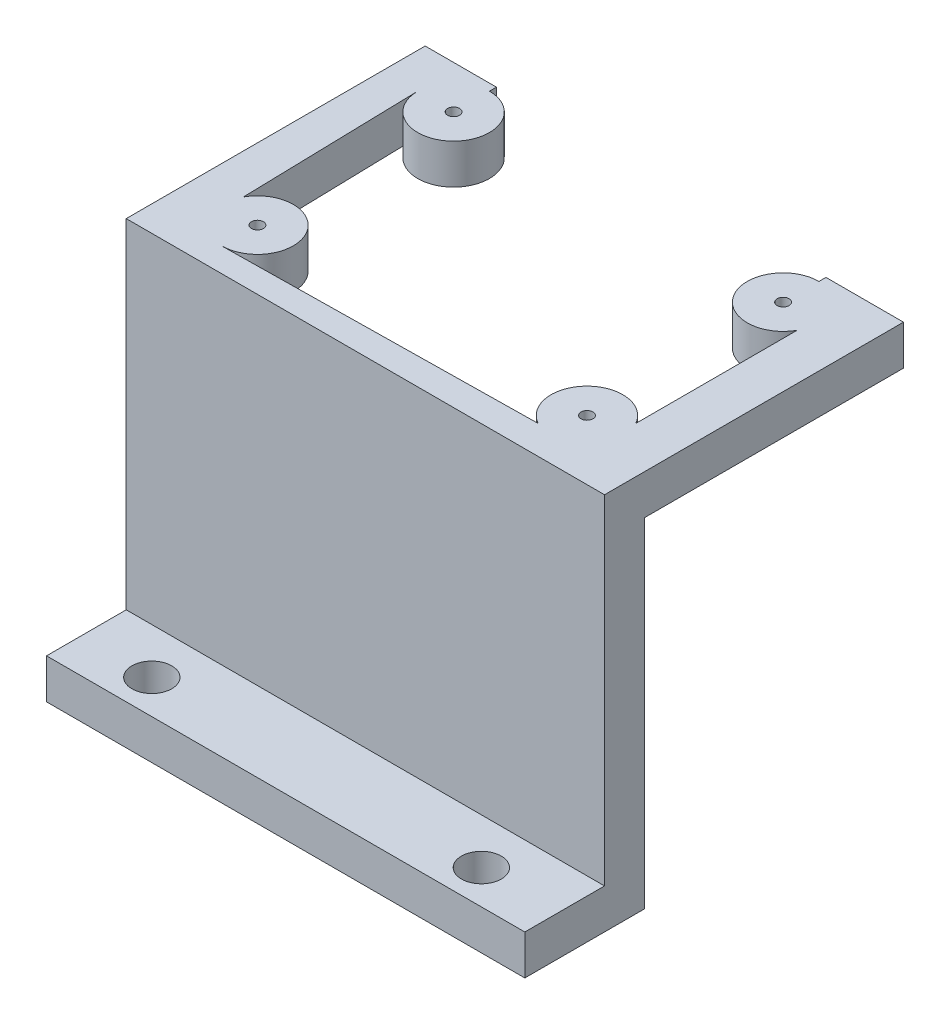
ISO-10303-21;
HEADER;
FILE_DESCRIPTION(('STEP AP214'),'2;1');
FILE_NAME('part.step','',(''),(''),'','','');
FILE_SCHEMA(('AUTOMOTIVE_DESIGN { 1 0 10303 214 1 1 1 1 }'));
ENDSEC;
DATA;
#1=APPLICATION_CONTEXT('core data for automotive mechanical design processes');
#2=APPLICATION_PROTOCOL_DEFINITION('international standard','automotive_design',2000,#1);
#3=PRODUCT_CONTEXT('',#1,'mechanical');
#4=PRODUCT('Part','Part','',(#3));
#5=PRODUCT_RELATED_PRODUCT_CATEGORY('part','',(#4));
#6=PRODUCT_DEFINITION_FORMATION('','',#4);
#7=PRODUCT_DEFINITION_CONTEXT('part definition',#1,'design');
#8=PRODUCT_DEFINITION('design','',#6,#7);
#9=PRODUCT_DEFINITION_SHAPE('','',#8);
#10=(LENGTH_UNIT() NAMED_UNIT(*) SI_UNIT(.MILLI.,.METRE.));
#11=(NAMED_UNIT(*) PLANE_ANGLE_UNIT() SI_UNIT($,.RADIAN.));
#12=(NAMED_UNIT(*) SI_UNIT($,.STERADIAN.) SOLID_ANGLE_UNIT());
#13=UNCERTAINTY_MEASURE_WITH_UNIT(LENGTH_MEASURE(1.E-05),#10,'distance_accuracy_value','');
#14=(GEOMETRIC_REPRESENTATION_CONTEXT(3) GLOBAL_UNCERTAINTY_ASSIGNED_CONTEXT((#13)) GLOBAL_UNIT_ASSIGNED_CONTEXT((#10,
#11,#12)) REPRESENTATION_CONTEXT('',''));
#15=CARTESIAN_POINT('',(0.,0.,0.));
#16=DIRECTION('',(0.,0.,1.));
#17=DIRECTION('',(1.,0.,0.));
#18=AXIS2_PLACEMENT_3D('',#15,#16,#17);
#19=CARTESIAN_POINT('',(30.48,21.59,-7.62));
#20=DIRECTION('',(0.,1.,0.));
#21=DIRECTION('',(0.,0.,1.));
#22=AXIS2_PLACEMENT_3D('',#19,#20,#21);
#23=PLANE('',#22);
#24=CARTESIAN_POINT('',(4.54000000000002,21.59,-8.8999999999997));
#25=DIRECTION('',(0.,1.,0.));
#26=DIRECTION('',(0.,0.,1.));
#27=AXIS2_PLACEMENT_3D('',#24,#25,#26);
#28=CIRCLE('',#27,0.380999999999998);
#29=CARTESIAN_POINT('',(4.54000000000002,21.59,-8.5189999999997));
#30=VERTEX_POINT('',#29);
#31=EDGE_CURVE('E236',#30,#30,#28,.T.);
#32=ORIENTED_EDGE('',*,*,#31,.T.);
#33=EDGE_LOOP('',(#32));
#34=FACE_BOUND('',#33,.T.);
#35=CARTESIAN_POINT('',(4.54000000000002,21.59,-21.3999999999997));
#36=DIRECTION('',(0.,1.,0.));
#37=DIRECTION('',(0.,0.,1.));
#38=AXIS2_PLACEMENT_3D('',#35,#36,#37);
#39=CIRCLE('',#38,0.380999999999998);
#40=CARTESIAN_POINT('',(4.54000000000002,21.59,-21.0189999999997));
#41=VERTEX_POINT('',#40);
#42=EDGE_CURVE('E232',#41,#41,#39,.T.);
#43=ORIENTED_EDGE('',*,*,#42,.T.);
#44=EDGE_LOOP('',(#43));
#45=FACE_BOUND('',#44,.T.);
#46=DIRECTION('',(0.0251590468472713,0.,0.999683461082425));
#47=VECTOR('',#46,1.);
#48=CARTESIAN_POINT('',(2.25472360796561,21.59,-21.3424864189071));
#49=LINE('',#48,#47);
#50=CARTESIAN_POINT('',(2.25472360796561,21.59,-21.3424864189071));
#51=VERTEX_POINT('',#50);
#52=CARTESIAN_POINT('',(2.54000000000004,21.59,-10.0071567188072));
#53=VERTEX_POINT('',#52);
#54=EDGE_CURVE('E282',#51,#53,#49,.T.);
#55=ORIENTED_EDGE('',*,*,#54,.T.);
#56=CARTESIAN_POINT('',(4.54000000000004,21.59,-8.9));
#57=DIRECTION('',(0.,-1.,0.));
#58=DIRECTION('',(0.,0.,1.));
#59=AXIS2_PLACEMENT_3D('',#56,#57,#58);
#60=CIRCLE('',#59,2.286);
#61=CARTESIAN_POINT('',(6.43404223817742,21.59,-7.62));
#62=VERTEX_POINT('',#61);
#63=EDGE_CURVE('E248',#53,#62,#60,.T.);
#64=ORIENTED_EDGE('',*,*,#63,.T.);
#65=DIRECTION('',(-1.,0.,0.));
#66=VECTOR('',#65,1.);
#67=CARTESIAN_POINT('',(30.48,21.59,-7.62));
#68=LINE('',#67,#66);
#69=CARTESIAN_POINT('',(0.,21.59,-7.62));
#70=VERTEX_POINT('',#69);
#71=EDGE_CURVE('E196',#62,#70,#68,.T.);
#72=ORIENTED_EDGE('',*,*,#71,.T.);
#73=DIRECTION('',(0.,0.,-1.));
#74=VECTOR('',#73,1.);
#75=CARTESIAN_POINT('',(0.,21.59,-7.62));
#76=LINE('',#75,#74);
#77=CARTESIAN_POINT('',(0.,21.59,-24.13));
#78=VERTEX_POINT('',#77);
#79=EDGE_CURVE('E168',#70,#78,#76,.T.);
#80=ORIENTED_EDGE('',*,*,#79,.T.);
#81=DIRECTION('',(-1.,0.,0.));
#82=VECTOR('',#81,1.);
#83=CARTESIAN_POINT('',(30.48,21.59,-24.13));
#84=LINE('',#83,#82);
#85=CARTESIAN_POINT('',(4.54000000000003,21.59,-24.13));
#86=VERTEX_POINT('',#85);
#87=EDGE_CURVE('E191',#86,#78,#84,.T.);
#88=ORIENTED_EDGE('',*,*,#87,.F.);
#89=DIRECTION('',(0.,0.,1.));
#90=VECTOR('',#89,1.);
#91=CARTESIAN_POINT('',(4.54000000000004,21.59,-23.686));
#92=LINE('',#91,#90);
#93=CARTESIAN_POINT('',(4.54000000000004,21.59,-23.686));
#94=VERTEX_POINT('',#93);
#95=EDGE_CURVE('E274',#86,#94,#92,.T.);
#96=ORIENTED_EDGE('',*,*,#95,.T.);
#97=CARTESIAN_POINT('',(4.54000000000004,21.59,-21.4));
#98=DIRECTION('',(0.,-1.,0.));
#99=DIRECTION('',(0.,0.,1.));
#100=AXIS2_PLACEMENT_3D('',#97,#98,#99);
#101=CIRCLE('',#100,2.286);
#102=EDGE_CURVE('E278',#94,#51,#101,.T.);
#103=ORIENTED_EDGE('',*,*,#102,.T.);
#104=EDGE_LOOP('',(#55,#64,#72,#80,#88,#96,#103));
#105=FACE_BOUND('',#104,.T.);
#106=ADVANCED_FACE('F39',(#34,#45,#105),#23,.F.);
#107=CARTESIAN_POINT('',(25.54,21.59,-8.8999999999997));
#108=DIRECTION('',(0.,1.,0.));
#109=DIRECTION('',(0.,0.,1.));
#110=AXIS2_PLACEMENT_3D('',#107,#108,#109);
#111=CIRCLE('',#110,0.381000000000001);
#112=CARTESIAN_POINT('',(25.54,21.59,-8.5189999999997));
#113=VERTEX_POINT('',#112);
#114=EDGE_CURVE('E244',#113,#113,#111,.T.);
#115=ORIENTED_EDGE('',*,*,#114,.T.);
#116=EDGE_LOOP('',(#115));
#117=FACE_BOUND('',#116,.T.);
#118=CARTESIAN_POINT('',(25.54,21.59,-21.3999999999997));
#119=DIRECTION('',(0.,1.,0.));
#120=DIRECTION('',(0.,0.,1.));
#121=AXIS2_PLACEMENT_3D('',#118,#119,#120);
#122=CIRCLE('',#121,0.381000000000001);
#123=CARTESIAN_POINT('',(25.54,21.59,-21.0189999999997));
#124=VERTEX_POINT('',#123);
#125=EDGE_CURVE('E240',#124,#124,#122,.T.);
#126=ORIENTED_EDGE('',*,*,#125,.T.);
#127=EDGE_LOOP('',(#126));
#128=FACE_BOUND('',#127,.T.);
#129=CARTESIAN_POINT('',(25.54,21.59,-21.4));
#130=DIRECTION('',(0.,-1.,0.));
#131=DIRECTION('',(0.,0.,1.));
#132=AXIS2_PLACEMENT_3D('',#129,#130,#131);
#133=CIRCLE('',#132,2.286);
#134=CARTESIAN_POINT('',(27.54,21.59,-20.2928432811928));
#135=VERTEX_POINT('',#134);
#136=CARTESIAN_POINT('',(25.54,21.59,-23.686));
#137=VERTEX_POINT('',#136);
#138=EDGE_CURVE('E266',#135,#137,#133,.T.);
#139=ORIENTED_EDGE('',*,*,#138,.T.);
#140=DIRECTION('',(0.,0.,-1.));
#141=VECTOR('',#140,1.);
#142=CARTESIAN_POINT('',(25.54,21.59,-25.5814174782081));
#143=LINE('',#142,#141);
#144=CARTESIAN_POINT('',(25.54,21.59,-24.13));
#145=VERTEX_POINT('',#144);
#146=EDGE_CURVE('E270',#137,#145,#143,.T.);
#147=ORIENTED_EDGE('',*,*,#146,.T.);
#148=CARTESIAN_POINT('',(30.48,21.59,-24.13));
#149=VERTEX_POINT('',#148);
#150=EDGE_CURVE('E192',#149,#145,#84,.T.);
#151=ORIENTED_EDGE('',*,*,#150,.F.);
#152=DIRECTION('',(0.,0.,-1.));
#153=VECTOR('',#152,1.);
#154=CARTESIAN_POINT('',(30.48,21.59,-7.62));
#155=LINE('',#154,#153);
#156=CARTESIAN_POINT('',(30.48,21.59,-7.62));
#157=VERTEX_POINT('',#156);
#158=EDGE_CURVE('E364',#157,#149,#155,.T.);
#159=ORIENTED_EDGE('',*,*,#158,.F.);
#160=CARTESIAN_POINT('',(23.6459577618227,21.59,-7.62));
#161=VERTEX_POINT('',#160);
#162=EDGE_CURVE('E197',#157,#161,#68,.T.);
#163=ORIENTED_EDGE('',*,*,#162,.T.);
#164=CARTESIAN_POINT('',(25.54,21.59,-8.9));
#165=DIRECTION('',(0.,-1.,0.));
#166=DIRECTION('',(0.,0.,1.));
#167=AXIS2_PLACEMENT_3D('',#164,#165,#166);
#168=CIRCLE('',#167,2.286);
#169=CARTESIAN_POINT('',(27.54,21.59,-10.0071567188072));
#170=VERTEX_POINT('',#169);
#171=EDGE_CURVE('E257',#161,#170,#168,.T.);
#172=ORIENTED_EDGE('',*,*,#171,.T.);
#173=DIRECTION('',(0.,0.,-1.));
#174=VECTOR('',#173,1.);
#175=CARTESIAN_POINT('',(27.54,21.59,-20.2928432811928));
#176=LINE('',#175,#174);
#177=EDGE_CURVE('E262',#170,#135,#176,.T.);
#178=ORIENTED_EDGE('',*,*,#177,.T.);
#179=EDGE_LOOP('',(#139,#147,#151,#159,#163,#172,#178));
#180=FACE_BOUND('',#179,.T.);
#181=ADVANCED_FACE('F420',(#117,#128,#180),#23,.F.);
#182=CARTESIAN_POINT('',(30.48,21.59,-24.13));
#183=DIRECTION('',(0.,0.,1.));
#184=DIRECTION('',(1.,0.,0.));
#185=AXIS2_PLACEMENT_3D('',#182,#183,#184);
#186=PLANE('',#185);
#187=DIRECTION('',(-1.,0.,0.));
#188=VECTOR('',#187,1.);
#189=CARTESIAN_POINT('',(30.48,24.13,-24.13));
#190=LINE('',#189,#188);
#191=CARTESIAN_POINT('',(4.54000000000003,24.13,-24.13));
#192=VERTEX_POINT('',#191);
#193=CARTESIAN_POINT('',(0.,24.13,-24.13));
#194=VERTEX_POINT('',#193);
#195=EDGE_CURVE('E145',#192,#194,#190,.T.);
#196=ORIENTED_EDGE('',*,*,#195,.F.);
#197=DIRECTION('',(0.,-1.,0.));
#198=VECTOR('',#197,1.);
#199=CARTESIAN_POINT('',(4.54000000000003,21.59,-24.13));
#200=LINE('',#199,#198);
#201=EDGE_CURVE('E350',#192,#86,#200,.T.);
#202=ORIENTED_EDGE('',*,*,#201,.T.);
#203=ORIENTED_EDGE('',*,*,#87,.T.);
#204=DIRECTION('',(0.,1.,0.));
#205=VECTOR('',#204,1.);
#206=CARTESIAN_POINT('',(0.,21.59,-24.13));
#207=LINE('',#206,#205);
#208=EDGE_CURVE('E172',#78,#194,#207,.T.);
#209=ORIENTED_EDGE('',*,*,#208,.T.);
#210=EDGE_LOOP('',(#196,#202,#203,#209));
#211=FACE_BOUND('',#210,.T.);
#212=ADVANCED_FACE('F413',(#211),#186,.F.);
#213=CARTESIAN_POINT('',(30.48,2.54,0.));
#214=DIRECTION('',(0.,0.,-1.));
#215=DIRECTION('',(-1.,0.,0.));
#216=AXIS2_PLACEMENT_3D('',#213,#214,#215);
#217=PLANE('',#216);
#218=DIRECTION('',(0.,-1.,0.));
#219=VECTOR('',#218,1.);
#220=CARTESIAN_POINT('',(0.,2.54,0.));
#221=LINE('',#220,#219);
#222=CARTESIAN_POINT('',(0.,2.54,0.));
#223=VERTEX_POINT('',#222);
#224=CARTESIAN_POINT('',(0.,0.,0.));
#225=VERTEX_POINT('',#224);
#226=EDGE_CURVE('E156',#223,#225,#221,.T.);
#227=ORIENTED_EDGE('',*,*,#226,.T.);
#228=DIRECTION('',(-1.,0.,0.));
#229=VECTOR('',#228,1.);
#230=CARTESIAN_POINT('',(30.48,0.,0.));
#231=LINE('',#230,#229);
#232=CARTESIAN_POINT('',(30.48,0.,0.));
#233=VERTEX_POINT('',#232);
#234=EDGE_CURVE('E49',#233,#225,#231,.T.);
#235=ORIENTED_EDGE('',*,*,#234,.F.);
#236=DIRECTION('',(0.,-1.,0.));
#237=VECTOR('',#236,1.);
#238=CARTESIAN_POINT('',(30.48,2.54,0.));
#239=LINE('',#238,#237);
#240=CARTESIAN_POINT('',(30.48,2.54,0.));
#241=VERTEX_POINT('',#240);
#242=EDGE_CURVE('E183',#241,#233,#239,.T.);
#243=ORIENTED_EDGE('',*,*,#242,.F.);
#244=DIRECTION('',(-1.,0.,0.));
#245=VECTOR('',#244,1.);
#246=CARTESIAN_POINT('',(30.48,2.54,0.));
#247=LINE('',#246,#245);
#248=EDGE_CURVE('E152',#241,#223,#247,.T.);
#249=ORIENTED_EDGE('',*,*,#248,.T.);
#250=EDGE_LOOP('',(#227,#235,#243,#249));
#251=FACE_BOUND('',#250,.T.);
#252=ADVANCED_FACE('F41',(#251),#217,.F.);
#253=CARTESIAN_POINT('',(30.48,0.,0.));
#254=DIRECTION('',(0.,1.,0.));
#255=DIRECTION('',(0.,0.,1.));
#256=AXIS2_PLACEMENT_3D('',#253,#254,#255);
#257=PLANE('',#256);
#258=CARTESIAN_POINT('',(4.54000000000002,0.,-2.16982805603519));
#259=DIRECTION('',(0.,1.,0.));
#260=DIRECTION('',(0.,0.,1.));
#261=AXIS2_PLACEMENT_3D('',#258,#259,#260);
#262=CIRCLE('',#261,1.27);
#263=CARTESIAN_POINT('',(4.54000000000002,0.,-0.899828056035189));
#264=VERTEX_POINT('',#263);
#265=EDGE_CURVE('E228',#264,#264,#262,.T.);
#266=ORIENTED_EDGE('',*,*,#265,.T.);
#267=EDGE_LOOP('',(#266));
#268=FACE_BOUND('',#267,.T.);
#269=CARTESIAN_POINT('',(25.54,0.,-2.16982805603519));
#270=DIRECTION('',(0.,1.,0.));
#271=DIRECTION('',(0.,0.,1.));
#272=AXIS2_PLACEMENT_3D('',#269,#270,#271);
#273=CIRCLE('',#272,1.27);
#274=CARTESIAN_POINT('',(25.54,0.,-0.899828056035188));
#275=VERTEX_POINT('',#274);
#276=EDGE_CURVE('E209',#275,#275,#273,.T.);
#277=ORIENTED_EDGE('',*,*,#276,.T.);
#278=EDGE_LOOP('',(#277));
#279=FACE_BOUND('',#278,.T.);
#280=DIRECTION('',(0.,0.,-1.));
#281=VECTOR('',#280,1.);
#282=CARTESIAN_POINT('',(0.,0.,0.));
#283=LINE('',#282,#281);
#284=CARTESIAN_POINT('',(0.,0.,-7.62));
#285=VERTEX_POINT('',#284);
#286=EDGE_CURVE('E160',#225,#285,#283,.T.);
#287=ORIENTED_EDGE('',*,*,#286,.T.);
#288=DIRECTION('',(-1.,0.,0.));
#289=VECTOR('',#288,1.);
#290=CARTESIAN_POINT('',(30.48,0.,-7.62));
#291=LINE('',#290,#289);
#292=CARTESIAN_POINT('',(30.48,0.,-7.62));
#293=VERTEX_POINT('',#292);
#294=EDGE_CURVE('E201',#293,#285,#291,.T.);
#295=ORIENTED_EDGE('',*,*,#294,.F.);
#296=DIRECTION('',(0.,0.,-1.));
#297=VECTOR('',#296,1.);
#298=CARTESIAN_POINT('',(30.48,0.,0.));
#299=LINE('',#298,#297);
#300=EDGE_CURVE('E108',#233,#293,#299,.T.);
#301=ORIENTED_EDGE('',*,*,#300,.F.);
#302=ORIENTED_EDGE('',*,*,#234,.T.);
#303=EDGE_LOOP('',(#287,#295,#301,#302));
#304=FACE_BOUND('',#303,.T.);
#305=ADVANCED_FACE('F385',(#268,#279,#304),#257,.F.);
#306=CARTESIAN_POINT('',(30.48,0.,-7.62));
#307=DIRECTION('',(0.,0.,1.));
#308=DIRECTION('',(1.,0.,0.));
#309=AXIS2_PLACEMENT_3D('',#306,#307,#308);
#310=PLANE('',#309);
#311=DIRECTION('',(0.,1.,0.));
#312=VECTOR('',#311,1.);
#313=CARTESIAN_POINT('',(0.,0.,-7.62));
#314=LINE('',#313,#312);
#315=EDGE_CURVE('E164',#285,#70,#314,.T.);
#316=ORIENTED_EDGE('',*,*,#315,.T.);
#317=ORIENTED_EDGE('',*,*,#71,.F.);
#318=DIRECTION('',(-1.,0.,0.));
#319=VECTOR('',#318,1.);
#320=CARTESIAN_POINT('',(30.48,21.59,-7.62));
#321=LINE('',#320,#319);
#322=EDGE_CURVE('E161',#161,#62,#321,.T.);
#323=ORIENTED_EDGE('',*,*,#322,.F.);
#324=ORIENTED_EDGE('',*,*,#162,.F.);
#325=DIRECTION('',(0.,1.,0.));
#326=VECTOR('',#325,1.);
#327=CARTESIAN_POINT('',(30.48,0.,-7.62));
#328=LINE('',#327,#326);
#329=EDGE_CURVE('E361',#293,#157,#328,.T.);
#330=ORIENTED_EDGE('',*,*,#329,.F.);
#331=ORIENTED_EDGE('',*,*,#294,.T.);
#332=EDGE_LOOP('',(#316,#317,#323,#324,#330,#331));
#333=FACE_BOUND('',#332,.T.);
#334=ADVANCED_FACE('F388',(#333),#310,.F.);
#335=ORIENTED_EDGE('',*,*,#150,.T.);
#336=DIRECTION('',(0.,1.,0.));
#337=VECTOR('',#336,1.);
#338=CARTESIAN_POINT('',(25.54,21.59,-24.13));
#339=LINE('',#338,#337);
#340=CARTESIAN_POINT('',(25.54,24.13,-24.13));
#341=VERTEX_POINT('',#340);
#342=EDGE_CURVE('E320',#145,#341,#339,.T.);
#343=ORIENTED_EDGE('',*,*,#342,.T.);
#344=CARTESIAN_POINT('',(30.48,24.13,-24.13));
#345=VERTEX_POINT('',#344);
#346=EDGE_CURVE('E188',#345,#341,#190,.T.);
#347=ORIENTED_EDGE('',*,*,#346,.F.);
#348=DIRECTION('',(0.,1.,0.));
#349=VECTOR('',#348,1.);
#350=CARTESIAN_POINT('',(30.48,21.59,-24.13));
#351=LINE('',#350,#349);
#352=EDGE_CURVE('E130',#149,#345,#351,.T.);
#353=ORIENTED_EDGE('',*,*,#352,.F.);
#354=EDGE_LOOP('',(#335,#343,#347,#353));
#355=FACE_BOUND('',#354,.T.);
#356=ADVANCED_FACE('F424',(#355),#186,.F.);
#357=CARTESIAN_POINT('',(30.48,24.13,-24.13));
#358=DIRECTION('',(0.,-1.,0.));
#359=DIRECTION('',(0.,0.,-1.));
#360=AXIS2_PLACEMENT_3D('',#357,#358,#359);
#361=PLANE('',#360);
#362=CARTESIAN_POINT('',(25.54,24.13,-8.8999999999997));
#363=DIRECTION('',(0.,1.,0.));
#364=DIRECTION('',(0.,0.,1.));
#365=AXIS2_PLACEMENT_3D('',#362,#363,#364);
#366=CIRCLE('',#365,0.381000000000001);
#367=CARTESIAN_POINT('',(25.54,24.13,-8.5189999999997));
#368=VERTEX_POINT('',#367);
#369=EDGE_CURVE('E731',#368,#368,#366,.T.);
#370=ORIENTED_EDGE('',*,*,#369,.F.);
#371=EDGE_LOOP('',(#370));
#372=FACE_BOUND('',#371,.T.);
#373=CARTESIAN_POINT('',(25.54,24.13,-21.3999999999997));
#374=DIRECTION('',(0.,1.,0.));
#375=DIRECTION('',(0.,0.,1.));
#376=AXIS2_PLACEMENT_3D('',#373,#374,#375);
#377=CIRCLE('',#376,0.381000000000001);
#378=CARTESIAN_POINT('',(25.54,24.13,-21.0189999999997));
#379=VERTEX_POINT('',#378);
#380=EDGE_CURVE('E224',#379,#379,#377,.T.);
#381=ORIENTED_EDGE('',*,*,#380,.F.);
#382=EDGE_LOOP('',(#381));
#383=FACE_BOUND('',#382,.T.);
#384=CARTESIAN_POINT('',(4.54000000000002,24.13,-8.8999999999997));
#385=DIRECTION('',(0.,1.,0.));
#386=DIRECTION('',(0.,0.,1.));
#387=AXIS2_PLACEMENT_3D('',#384,#385,#386);
#388=CIRCLE('',#387,0.380999999999998);
#389=CARTESIAN_POINT('',(4.54000000000002,24.13,-8.5189999999997));
#390=VERTEX_POINT('',#389);
#391=EDGE_CURVE('E218',#390,#390,#388,.T.);
#392=ORIENTED_EDGE('',*,*,#391,.F.);
#393=EDGE_LOOP('',(#392));
#394=FACE_BOUND('',#393,.T.);
#395=CARTESIAN_POINT('',(4.54000000000002,24.13,-21.3999999999997));
#396=DIRECTION('',(0.,1.,0.));
#397=DIRECTION('',(0.,0.,1.));
#398=AXIS2_PLACEMENT_3D('',#395,#396,#397);
#399=CIRCLE('',#398,0.380999999999998);
#400=CARTESIAN_POINT('',(4.54000000000002,24.13,-21.0189999999997));
#401=VERTEX_POINT('',#400);
#402=EDGE_CURVE('E210',#401,#401,#399,.T.);
#403=ORIENTED_EDGE('',*,*,#402,.F.);
#404=EDGE_LOOP('',(#403));
#405=FACE_BOUND('',#404,.T.);
#406=CARTESIAN_POINT('',(4.54000000000004,24.13,-21.4));
#407=DIRECTION('',(0.,-1.,0.));
#408=DIRECTION('',(0.,0.,1.));
#409=AXIS2_PLACEMENT_3D('',#406,#407,#408);
#410=CIRCLE('',#409,2.286);
#411=CARTESIAN_POINT('',(4.54000000000004,24.13,-23.686));
#412=VERTEX_POINT('',#411);
#413=CARTESIAN_POINT('',(2.25472360796561,24.13,-21.3424864189071));
#414=VERTEX_POINT('',#413);
#415=EDGE_CURVE('E309',#412,#414,#410,.T.);
#416=ORIENTED_EDGE('',*,*,#415,.F.);
#417=DIRECTION('',(0.,0.,-1.));
#418=VECTOR('',#417,1.);
#419=CARTESIAN_POINT('',(4.54000000000003,24.13,-24.1299999999996));
#420=LINE('',#419,#418);
#421=EDGE_CURVE('E11',#412,#192,#420,.T.);
#422=ORIENTED_EDGE('',*,*,#421,.T.);
#423=ORIENTED_EDGE('',*,*,#195,.T.);
#424=DIRECTION('',(0.,0.,1.));
#425=VECTOR('',#424,1.);
#426=CARTESIAN_POINT('',(0.,24.13,-24.13));
#427=LINE('',#426,#425);
#428=CARTESIAN_POINT('',(0.,24.13,-5.08));
#429=VERTEX_POINT('',#428);
#430=EDGE_CURVE('E141',#194,#429,#427,.T.);
#431=ORIENTED_EDGE('',*,*,#430,.T.);
#432=DIRECTION('',(-1.,0.,0.));
#433=VECTOR('',#432,1.);
#434=CARTESIAN_POINT('',(30.48,24.13,-5.08));
#435=LINE('',#434,#433);
#436=CARTESIAN_POINT('',(30.48,24.13,-5.08));
#437=VERTEX_POINT('',#436);
#438=EDGE_CURVE('E137',#437,#429,#435,.T.);
#439=ORIENTED_EDGE('',*,*,#438,.F.);
#440=DIRECTION('',(0.,0.,1.));
#441=VECTOR('',#440,1.);
#442=CARTESIAN_POINT('',(30.48,24.13,-24.13));
#443=LINE('',#442,#441);
#444=EDGE_CURVE('E123',#345,#437,#443,.T.);
#445=ORIENTED_EDGE('',*,*,#444,.F.);
#446=ORIENTED_EDGE('',*,*,#346,.T.);
#447=DIRECTION('',(0.,0.,-1.));
#448=VECTOR('',#447,1.);
#449=CARTESIAN_POINT('',(25.54,24.13,-25.5814174782081));
#450=LINE('',#449,#448);
#451=CARTESIAN_POINT('',(25.54,24.13,-23.686));
#452=VERTEX_POINT('',#451);
#453=EDGE_CURVE('E305',#452,#341,#450,.T.);
#454=ORIENTED_EDGE('',*,*,#453,.F.);
#455=CARTESIAN_POINT('',(25.54,24.13,-21.4));
#456=DIRECTION('',(0.,-1.,0.));
#457=DIRECTION('',(0.,0.,1.));
#458=AXIS2_PLACEMENT_3D('',#455,#456,#457);
#459=CIRCLE('',#458,2.286);
#460=CARTESIAN_POINT('',(27.54,24.13,-20.2928432811928));
#461=VERTEX_POINT('',#460);
#462=EDGE_CURVE('E301',#461,#452,#459,.T.);
#463=ORIENTED_EDGE('',*,*,#462,.F.);
#464=DIRECTION('',(0.,0.,-1.));
#465=VECTOR('',#464,1.);
#466=CARTESIAN_POINT('',(27.54,24.13,-20.2928432811928));
#467=LINE('',#466,#465);
#468=CARTESIAN_POINT('',(27.54,24.13,-10.0071567188072));
#469=VERTEX_POINT('',#468);
#470=EDGE_CURVE('E297',#469,#461,#467,.T.);
#471=ORIENTED_EDGE('',*,*,#470,.F.);
#472=CARTESIAN_POINT('',(25.54,24.13,-8.9));
#473=DIRECTION('',(0.,-1.,0.));
#474=DIRECTION('',(0.,0.,1.));
#475=AXIS2_PLACEMENT_3D('',#472,#473,#474);
#476=CIRCLE('',#475,2.286);
#477=CARTESIAN_POINT('',(24.4328432811928,24.13,-6.9));
#478=VERTEX_POINT('',#477);
#479=EDGE_CURVE('E293',#478,#469,#476,.T.);
#480=ORIENTED_EDGE('',*,*,#479,.F.);
#481=DIRECTION('',(0.999896495486471,0.,-0.0143874359728982));
#482=VECTOR('',#481,1.);
#483=CARTESIAN_POINT('',(4.57288967863408,24.13,-6.61423661131793));
#484=LINE('',#483,#482);
#485=CARTESIAN_POINT('',(4.57288967863408,24.13,-6.61423661131793));
#486=VERTEX_POINT('',#485);
#487=EDGE_CURVE('E289',#486,#478,#484,.T.);
#488=ORIENTED_EDGE('',*,*,#487,.F.);
#489=CARTESIAN_POINT('',(4.54000000000004,24.13,-8.9));
#490=DIRECTION('',(0.,-1.,0.));
#491=DIRECTION('',(0.,0.,1.));
#492=AXIS2_PLACEMENT_3D('',#489,#490,#491);
#493=CIRCLE('',#492,2.286);
#494=CARTESIAN_POINT('',(2.54000000000004,24.13,-10.0071567188072));
#495=VERTEX_POINT('',#494);
#496=EDGE_CURVE('E57',#495,#486,#493,.T.);
#497=ORIENTED_EDGE('',*,*,#496,.F.);
#498=DIRECTION('',(0.0251590468472713,0.,0.999683461082425));
#499=VECTOR('',#498,1.);
#500=CARTESIAN_POINT('',(2.25472360796561,24.13,-21.3424864189071));
#501=LINE('',#500,#499);
#502=EDGE_CURVE('E313',#414,#495,#501,.T.);
#503=ORIENTED_EDGE('',*,*,#502,.F.);
#504=EDGE_LOOP('',(#416,#422,#423,#431,#439,#445,#446,#454,#463,#471,#480,#488,#497,#503));
#505=FACE_BOUND('',#504,.T.);
#506=ADVANCED_FACE('F139',(#372,#383,#394,#405,#505),#361,.F.);
#507=CARTESIAN_POINT('',(30.48,24.13,-5.08));
#508=DIRECTION('',(0.,0.,-1.));
#509=DIRECTION('',(0.,1.,0.));
#510=AXIS2_PLACEMENT_3D('',#507,#508,#509);
#511=PLANE('',#510);
#512=DIRECTION('',(0.,-1.,0.));
#513=VECTOR('',#512,1.);
#514=CARTESIAN_POINT('',(0.,24.13,-5.08));
#515=LINE('',#514,#513);
#516=CARTESIAN_POINT('',(0.,2.54,-5.08));
#517=VERTEX_POINT('',#516);
#518=EDGE_CURVE('E178',#429,#517,#515,.T.);
#519=ORIENTED_EDGE('',*,*,#518,.T.);
#520=DIRECTION('',(-1.,0.,0.));
#521=VECTOR('',#520,1.);
#522=CARTESIAN_POINT('',(30.48,2.54,-5.08));
#523=LINE('',#522,#521);
#524=CARTESIAN_POINT('',(30.48,2.54,-5.08));
#525=VERTEX_POINT('',#524);
#526=EDGE_CURVE('E146',#525,#517,#523,.T.);
#527=ORIENTED_EDGE('',*,*,#526,.F.);
#528=DIRECTION('',(0.,-1.,0.));
#529=VECTOR('',#528,1.);
#530=CARTESIAN_POINT('',(30.48,24.13,-5.08));
#531=LINE('',#530,#529);
#532=EDGE_CURVE('E127',#437,#525,#531,.T.);
#533=ORIENTED_EDGE('',*,*,#532,.F.);
#534=ORIENTED_EDGE('',*,*,#438,.T.);
#535=EDGE_LOOP('',(#519,#527,#533,#534));
#536=FACE_BOUND('',#535,.T.);
#537=ADVANCED_FACE('F148',(#536),#511,.F.);
#538=CARTESIAN_POINT('',(30.48,2.54,-5.08));
#539=DIRECTION('',(0.,-1.,0.));
#540=DIRECTION('',(0.,0.,-1.));
#541=AXIS2_PLACEMENT_3D('',#538,#539,#540);
#542=PLANE('',#541);
#543=CARTESIAN_POINT('',(4.54000000000002,2.54,-2.16982805603519));
#544=DIRECTION('',(0.,-1.,0.));
#545=DIRECTION('',(0.,0.,-1.));
#546=AXIS2_PLACEMENT_3D('',#543,#544,#545);
#547=CIRCLE('',#546,1.27);
#548=CARTESIAN_POINT('',(4.54000000000002,2.54,-0.899828056035189));
#549=VERTEX_POINT('',#548);
#550=EDGE_CURVE('E43',#549,#549,#547,.T.);
#551=ORIENTED_EDGE('',*,*,#550,.T.);
#552=EDGE_LOOP('',(#551));
#553=FACE_BOUND('',#552,.T.);
#554=CARTESIAN_POINT('',(25.54,2.54,-2.16982805603519));
#555=DIRECTION('',(0.,-1.,0.));
#556=DIRECTION('',(0.,0.,-1.));
#557=AXIS2_PLACEMENT_3D('',#554,#555,#556);
#558=CIRCLE('',#557,1.27);
#559=CARTESIAN_POINT('',(25.54,2.54,-0.899828056035188));
#560=VERTEX_POINT('',#559);
#561=EDGE_CURVE('E206',#560,#560,#558,.T.);
#562=ORIENTED_EDGE('',*,*,#561,.T.);
#563=EDGE_LOOP('',(#562));
#564=FACE_BOUND('',#563,.T.);
#565=DIRECTION('',(0.,0.,1.));
#566=VECTOR('',#565,1.);
#567=CARTESIAN_POINT('',(0.,2.54,-5.08));
#568=LINE('',#567,#566);
#569=EDGE_CURVE('E99',#517,#223,#568,.T.);
#570=ORIENTED_EDGE('',*,*,#569,.T.);
#571=ORIENTED_EDGE('',*,*,#248,.F.);
#572=DIRECTION('',(0.,0.,1.));
#573=VECTOR('',#572,1.);
#574=CARTESIAN_POINT('',(30.48,2.54,-5.08));
#575=LINE('',#574,#573);
#576=EDGE_CURVE('E66',#525,#241,#575,.T.);
#577=ORIENTED_EDGE('',*,*,#576,.F.);
#578=ORIENTED_EDGE('',*,*,#526,.T.);
#579=EDGE_LOOP('',(#570,#571,#577,#578));
#580=FACE_BOUND('',#579,.T.);
#581=ADVANCED_FACE('F375',(#553,#564,#580),#542,.F.);
#582=CARTESIAN_POINT('',(30.48,0.,0.));
#583=DIRECTION('',(1.,0.,0.));
#584=DIRECTION('',(0.,0.,-1.));
#585=AXIS2_PLACEMENT_3D('',#582,#583,#584);
#586=PLANE('',#585);
#587=ORIENTED_EDGE('',*,*,#242,.T.);
#588=ORIENTED_EDGE('',*,*,#300,.T.);
#589=ORIENTED_EDGE('',*,*,#329,.T.);
#590=ORIENTED_EDGE('',*,*,#158,.T.);
#591=ORIENTED_EDGE('',*,*,#352,.T.);
#592=ORIENTED_EDGE('',*,*,#444,.T.);
#593=ORIENTED_EDGE('',*,*,#532,.T.);
#594=ORIENTED_EDGE('',*,*,#576,.T.);
#595=EDGE_LOOP('',(#587,#588,#589,#590,#591,#592,#593,#594));
#596=FACE_BOUND('',#595,.T.);
#597=ADVANCED_FACE('F125',(#596),#586,.T.);
#598=CARTESIAN_POINT('',(0.,0.,0.));
#599=DIRECTION('',(1.,0.,0.));
#600=DIRECTION('',(0.,0.,-1.));
#601=AXIS2_PLACEMENT_3D('',#598,#599,#600);
#602=PLANE('',#601);
#603=ORIENTED_EDGE('',*,*,#226,.F.);
#604=ORIENTED_EDGE('',*,*,#569,.F.);
#605=ORIENTED_EDGE('',*,*,#518,.F.);
#606=ORIENTED_EDGE('',*,*,#430,.F.);
#607=ORIENTED_EDGE('',*,*,#208,.F.);
#608=ORIENTED_EDGE('',*,*,#79,.F.);
#609=ORIENTED_EDGE('',*,*,#315,.F.);
#610=ORIENTED_EDGE('',*,*,#286,.F.);
#611=EDGE_LOOP('',(#603,#604,#605,#606,#607,#608,#609,#610));
#612=FACE_BOUND('',#611,.T.);
#613=ADVANCED_FACE('F399',(#612),#602,.F.);
#614=CARTESIAN_POINT('',(4.54000000000004,21.59,-8.9));
#615=DIRECTION('',(0.,1.,0.));
#616=DIRECTION('',(0.,0.,1.));
#617=AXIS2_PLACEMENT_3D('',#614,#615,#616);
#618=PLANE('',#617);
#619=ORIENTED_EDGE('',*,*,#322,.T.);
#620=CARTESIAN_POINT('',(4.57288967863408,21.59,-6.61423661131793));
#621=VERTEX_POINT('',#620);
#622=EDGE_CURVE('E253',#62,#621,#60,.T.);
#623=ORIENTED_EDGE('',*,*,#622,.T.);
#624=DIRECTION('',(0.999896495486471,0.,-0.0143874359728982));
#625=VECTOR('',#624,1.);
#626=CARTESIAN_POINT('',(4.57288967863408,21.59,-6.61423661131793));
#627=LINE('',#626,#625);
#628=CARTESIAN_POINT('',(24.4328432811928,21.59,-6.9));
#629=VERTEX_POINT('',#628);
#630=EDGE_CURVE('E252',#621,#629,#627,.T.);
#631=ORIENTED_EDGE('',*,*,#630,.T.);
#632=EDGE_CURVE('E258',#629,#161,#168,.T.);
#633=ORIENTED_EDGE('',*,*,#632,.T.);
#634=EDGE_LOOP('',(#619,#623,#631,#633));
#635=FACE_BOUND('',#634,.T.);
#636=ADVANCED_FACE('F444',(#635),#618,.T.);
#637=CARTESIAN_POINT('',(4.54000000000004,21.59,-23.686));
#638=DIRECTION('',(-1.,0.,0.));
#639=DIRECTION('',(0.,0.,1.));
#640=AXIS2_PLACEMENT_3D('',#637,#638,#639);
#641=PLANE('',#640);
#642=ORIENTED_EDGE('',*,*,#421,.F.);
#643=DIRECTION('',(0.,1.,0.));
#644=VECTOR('',#643,1.);
#645=CARTESIAN_POINT('',(4.54000000000004,21.59,-23.686));
#646=LINE('',#645,#644);
#647=EDGE_CURVE('E325',#94,#412,#646,.T.);
#648=ORIENTED_EDGE('',*,*,#647,.F.);
#649=ORIENTED_EDGE('',*,*,#95,.F.);
#650=ORIENTED_EDGE('',*,*,#201,.F.);
#651=EDGE_LOOP('',(#642,#648,#649,#650));
#652=FACE_BOUND('',#651,.T.);
#653=ADVANCED_FACE('F500',(#652),#641,.F.);
#654=CARTESIAN_POINT('',(25.54,21.59,-25.5814174782081));
#655=DIRECTION('',(1.,0.,0.));
#656=DIRECTION('',(0.,0.,-1.));
#657=AXIS2_PLACEMENT_3D('',#654,#655,#656);
#658=PLANE('',#657);
#659=ORIENTED_EDGE('',*,*,#146,.F.);
#660=DIRECTION('',(0.,1.,0.));
#661=VECTOR('',#660,1.);
#662=CARTESIAN_POINT('',(25.54,21.59,-23.686));
#663=LINE('',#662,#661);
#664=EDGE_CURVE('E329',#137,#452,#663,.T.);
#665=ORIENTED_EDGE('',*,*,#664,.T.);
#666=ORIENTED_EDGE('',*,*,#453,.T.);
#667=ORIENTED_EDGE('',*,*,#342,.F.);
#668=EDGE_LOOP('',(#659,#665,#666,#667));
#669=FACE_BOUND('',#668,.T.);
#670=ADVANCED_FACE('F498',(#669),#658,.F.);
#671=CARTESIAN_POINT('',(4.54000000000004,21.59,-8.9));
#672=DIRECTION('',(0.,1.,0.));
#673=DIRECTION('',(0.,0.,1.));
#674=AXIS2_PLACEMENT_3D('',#671,#672,#673);
#675=CYLINDRICAL_SURFACE('',#674,2.286);
#676=ORIENTED_EDGE('',*,*,#496,.T.);
#677=DIRECTION('',(0.,1.,0.));
#678=VECTOR('',#677,1.);
#679=CARTESIAN_POINT('',(4.57288967863408,21.59,-6.61423661131793));
#680=LINE('',#679,#678);
#681=EDGE_CURVE('E286',#621,#486,#680,.T.);
#682=ORIENTED_EDGE('',*,*,#681,.F.);
#683=ORIENTED_EDGE('',*,*,#622,.F.);
#684=ORIENTED_EDGE('',*,*,#63,.F.);
#685=DIRECTION('',(0.,1.,0.));
#686=VECTOR('',#685,1.);
#687=CARTESIAN_POINT('',(2.54000000000004,21.59,-10.0071567188072));
#688=LINE('',#687,#686);
#689=EDGE_CURVE('E317',#53,#495,#688,.T.);
#690=ORIENTED_EDGE('',*,*,#689,.T.);
#691=EDGE_LOOP('',(#676,#682,#683,#684,#690));
#692=FACE_BOUND('',#691,.T.);
#693=ADVANCED_FACE('F447',(#692),#675,.T.);
#694=CARTESIAN_POINT('',(2.25472360796561,21.59,-21.3424864189071));
#695=DIRECTION('',(-0.999683461082425,0.,0.0251590468472713));
#696=DIRECTION('',(0.0251590468472713,0.,0.999683461082425));
#697=AXIS2_PLACEMENT_3D('',#694,#695,#696);
#698=PLANE('',#697);
#699=ORIENTED_EDGE('',*,*,#502,.T.);
#700=ORIENTED_EDGE('',*,*,#689,.F.);
#701=ORIENTED_EDGE('',*,*,#54,.F.);
#702=DIRECTION('',(0.,1.,0.));
#703=VECTOR('',#702,1.);
#704=CARTESIAN_POINT('',(2.25472360796561,21.59,-21.3424864189071));
#705=LINE('',#704,#703);
#706=EDGE_CURVE('E321',#51,#414,#705,.T.);
#707=ORIENTED_EDGE('',*,*,#706,.T.);
#708=EDGE_LOOP('',(#699,#700,#701,#707));
#709=FACE_BOUND('',#708,.T.);
#710=ADVANCED_FACE('F487',(#709),#698,.F.);
#711=CARTESIAN_POINT('',(4.54000000000004,21.59,-21.4));
#712=DIRECTION('',(0.,1.,0.));
#713=DIRECTION('',(0.,0.,1.));
#714=AXIS2_PLACEMENT_3D('',#711,#712,#713);
#715=CYLINDRICAL_SURFACE('',#714,2.286);
#716=ORIENTED_EDGE('',*,*,#415,.T.);
#717=ORIENTED_EDGE('',*,*,#706,.F.);
#718=ORIENTED_EDGE('',*,*,#102,.F.);
#719=ORIENTED_EDGE('',*,*,#647,.T.);
#720=EDGE_LOOP('',(#716,#717,#718,#719));
#721=FACE_BOUND('',#720,.T.);
#722=ADVANCED_FACE('F628',(#721),#715,.T.);
#723=CARTESIAN_POINT('',(25.54,21.59,-21.4));
#724=DIRECTION('',(0.,1.,0.));
#725=DIRECTION('',(0.,0.,1.));
#726=AXIS2_PLACEMENT_3D('',#723,#724,#725);
#727=CYLINDRICAL_SURFACE('',#726,2.286);
#728=ORIENTED_EDGE('',*,*,#462,.T.);
#729=ORIENTED_EDGE('',*,*,#664,.F.);
#730=ORIENTED_EDGE('',*,*,#138,.F.);
#731=DIRECTION('',(0.,1.,0.));
#732=VECTOR('',#731,1.);
#733=CARTESIAN_POINT('',(27.54,21.59,-20.2928432811928));
#734=LINE('',#733,#732);
#735=EDGE_CURVE('E333',#135,#461,#734,.T.);
#736=ORIENTED_EDGE('',*,*,#735,.T.);
#737=EDGE_LOOP('',(#728,#729,#730,#736));
#738=FACE_BOUND('',#737,.T.);
#739=ADVANCED_FACE('F497',(#738),#727,.T.);
#740=CARTESIAN_POINT('',(27.54,21.59,-20.2928432811928));
#741=DIRECTION('',(1.,0.,0.));
#742=DIRECTION('',(0.,0.,-1.));
#743=AXIS2_PLACEMENT_3D('',#740,#741,#742);
#744=PLANE('',#743);
#745=ORIENTED_EDGE('',*,*,#470,.T.);
#746=ORIENTED_EDGE('',*,*,#735,.F.);
#747=ORIENTED_EDGE('',*,*,#177,.F.);
#748=DIRECTION('',(0.,1.,0.));
#749=VECTOR('',#748,1.);
#750=CARTESIAN_POINT('',(27.54,21.59,-10.0071567188072));
#751=LINE('',#750,#749);
#752=EDGE_CURVE('E337',#170,#469,#751,.T.);
#753=ORIENTED_EDGE('',*,*,#752,.T.);
#754=EDGE_LOOP('',(#745,#746,#747,#753));
#755=FACE_BOUND('',#754,.T.);
#756=ADVANCED_FACE('F495',(#755),#744,.F.);
#757=CARTESIAN_POINT('',(25.54,21.59,-8.9));
#758=DIRECTION('',(0.,1.,0.));
#759=DIRECTION('',(0.,0.,1.));
#760=AXIS2_PLACEMENT_3D('',#757,#758,#759);
#761=CYLINDRICAL_SURFACE('',#760,2.286);
#762=ORIENTED_EDGE('',*,*,#479,.T.);
#763=ORIENTED_EDGE('',*,*,#752,.F.);
#764=ORIENTED_EDGE('',*,*,#171,.F.);
#765=ORIENTED_EDGE('',*,*,#632,.F.);
#766=DIRECTION('',(0.,1.,0.));
#767=VECTOR('',#766,1.);
#768=CARTESIAN_POINT('',(24.4328432811928,21.59,-6.9));
#769=LINE('',#768,#767);
#770=EDGE_CURVE('E341',#629,#478,#769,.T.);
#771=ORIENTED_EDGE('',*,*,#770,.T.);
#772=EDGE_LOOP('',(#762,#763,#764,#765,#771));
#773=FACE_BOUND('',#772,.T.);
#774=ADVANCED_FACE('F491',(#773),#761,.T.);
#775=CARTESIAN_POINT('',(4.57288967863408,21.59,-6.61423661131793));
#776=DIRECTION('',(0.0143874359728982,0.,0.999896495486471));
#777=DIRECTION('',(0.999896495486471,0.,-0.0143874359728982));
#778=AXIS2_PLACEMENT_3D('',#775,#776,#777);
#779=PLANE('',#778);
#780=ORIENTED_EDGE('',*,*,#487,.T.);
#781=ORIENTED_EDGE('',*,*,#770,.F.);
#782=ORIENTED_EDGE('',*,*,#630,.F.);
#783=ORIENTED_EDGE('',*,*,#681,.T.);
#784=EDGE_LOOP('',(#780,#781,#782,#783));
#785=FACE_BOUND('',#784,.T.);
#786=ADVANCED_FACE('F455',(#785),#779,.F.);
#787=CARTESIAN_POINT('',(25.54,-6.35000000000001,-2.16982805603519));
#788=DIRECTION('',(0.,1.,0.));
#789=DIRECTION('',(0.,0.,1.));
#790=AXIS2_PLACEMENT_3D('',#787,#788,#789);
#791=CYLINDRICAL_SURFACE('',#790,1.27);
#792=CARTESIAN_POINT('',(25.54,2.54,-0.899828056035188));
#793=CARTESIAN_POINT('',(25.54,2.51354166666667,-0.899828056035188));
#794=CARTESIAN_POINT('',(25.54,2.48708333333333,-0.899828056035188));
#795=CARTESIAN_POINT('',(25.54,2.43416666666667,-0.899828056035188));
#796=CARTESIAN_POINT('',(25.54,2.40770833333333,-0.899828056035188));
#797=CARTESIAN_POINT('',(25.54,2.35479166666667,-0.899828056035188));
#798=CARTESIAN_POINT('',(25.54,2.32833333333333,-0.899828056035188));
#799=CARTESIAN_POINT('',(25.54,2.27541666666667,-0.899828056035188));
#800=CARTESIAN_POINT('',(25.54,2.24895833333333,-0.899828056035188));
#801=CARTESIAN_POINT('',(25.54,2.19604166666667,-0.899828056035188));
#802=CARTESIAN_POINT('',(25.54,2.16958333333333,-0.899828056035188));
#803=CARTESIAN_POINT('',(25.54,2.11666666666667,-0.899828056035188));
#804=CARTESIAN_POINT('',(25.54,2.09020833333333,-0.899828056035188));
#805=CARTESIAN_POINT('',(25.54,2.03729166666666,-0.899828056035188));
#806=CARTESIAN_POINT('',(25.54,2.01083333333333,-0.899828056035188));
#807=CARTESIAN_POINT('',(25.54,1.95791666666667,-0.899828056035188));
#808=CARTESIAN_POINT('',(25.54,1.93145833333333,-0.899828056035188));
#809=CARTESIAN_POINT('',(25.54,1.87854166666667,-0.899828056035188));
#810=CARTESIAN_POINT('',(25.54,1.85208333333333,-0.899828056035188));
#811=CARTESIAN_POINT('',(25.54,1.79916666666667,-0.899828056035188));
#812=CARTESIAN_POINT('',(25.54,1.77270833333333,-0.899828056035188));
#813=CARTESIAN_POINT('',(25.54,1.71979166666667,-0.899828056035188));
#814=CARTESIAN_POINT('',(25.54,1.69333333333333,-0.899828056035188));
#815=CARTESIAN_POINT('',(25.54,1.64041666666667,-0.899828056035188));
#816=CARTESIAN_POINT('',(25.54,1.61395833333333,-0.899828056035188));
#817=CARTESIAN_POINT('',(25.54,1.56104166666667,-0.899828056035188));
#818=CARTESIAN_POINT('',(25.54,1.53458333333333,-0.899828056035188));
#819=CARTESIAN_POINT('',(25.54,1.48166666666667,-0.899828056035188));
#820=CARTESIAN_POINT('',(25.54,1.45520833333333,-0.899828056035188));
#821=CARTESIAN_POINT('',(25.54,1.40229166666667,-0.899828056035188));
#822=CARTESIAN_POINT('',(25.54,1.37583333333333,-0.899828056035188));
#823=CARTESIAN_POINT('',(25.54,1.32291666666667,-0.899828056035188));
#824=CARTESIAN_POINT('',(25.54,1.29645833333333,-0.899828056035188));
#825=CARTESIAN_POINT('',(25.54,1.24354166666667,-0.899828056035188));
#826=CARTESIAN_POINT('',(25.54,1.21708333333333,-0.899828056035188));
#827=CARTESIAN_POINT('',(25.54,1.16416666666667,-0.899828056035188));
#828=CARTESIAN_POINT('',(25.54,1.13770833333333,-0.899828056035188));
#829=CARTESIAN_POINT('',(25.54,1.08479166666667,-0.899828056035188));
#830=CARTESIAN_POINT('',(25.54,1.05833333333333,-0.899828056035188));
#831=CARTESIAN_POINT('',(25.54,1.00541666666667,-0.899828056035188));
#832=CARTESIAN_POINT('',(25.54,0.978958333333333,-0.899828056035188));
#833=CARTESIAN_POINT('',(25.54,0.926041666666666,-0.899828056035188));
#834=CARTESIAN_POINT('',(25.54,0.899583333333333,-0.899828056035188));
#835=CARTESIAN_POINT('',(25.54,0.846666666666666,-0.899828056035188));
#836=CARTESIAN_POINT('',(25.54,0.820208333333333,-0.899828056035188));
#837=CARTESIAN_POINT('',(25.54,0.767291666666666,-0.899828056035188));
#838=CARTESIAN_POINT('',(25.54,0.740833333333332,-0.899828056035188));
#839=CARTESIAN_POINT('',(25.54,0.687916666666666,-0.899828056035188));
#840=CARTESIAN_POINT('',(25.54,0.661458333333332,-0.899828056035188));
#841=CARTESIAN_POINT('',(25.54,0.608541666666666,-0.899828056035188));
#842=CARTESIAN_POINT('',(25.54,0.582083333333333,-0.899828056035188));
#843=CARTESIAN_POINT('',(25.54,0.529166666666666,-0.899828056035188));
#844=CARTESIAN_POINT('',(25.54,0.502708333333333,-0.899828056035188));
#845=CARTESIAN_POINT('',(25.54,0.449791666666666,-0.899828056035188));
#846=CARTESIAN_POINT('',(25.54,0.423333333333332,-0.899828056035188));
#847=CARTESIAN_POINT('',(25.54,0.370416666666666,-0.899828056035188));
#848=CARTESIAN_POINT('',(25.54,0.343958333333332,-0.899828056035188));
#849=CARTESIAN_POINT('',(25.54,0.291041666666666,-0.899828056035188));
#850=CARTESIAN_POINT('',(25.54,0.264583333333333,-0.899828056035188));
#851=CARTESIAN_POINT('',(25.54,0.211666666666666,-0.899828056035188));
#852=CARTESIAN_POINT('',(25.54,0.185208333333333,-0.899828056035188));
#853=CARTESIAN_POINT('',(25.54,0.132291666666666,-0.899828056035188));
#854=CARTESIAN_POINT('',(25.54,0.105833333333332,-0.899828056035188));
#855=CARTESIAN_POINT('',(25.54,0.0529166666666655,-0.899828056035188));
#856=CARTESIAN_POINT('',(25.54,0.0264583333333323,-0.899828056035188));
#857=CARTESIAN_POINT('',(25.54,0.,-0.899828056035188));
#858=B_SPLINE_CURVE_WITH_KNOTS('',3,(#792,#793,#794,#795,#796,#797,#798,#799,#800,#801,#802,
#803,#804,#805,#806,#807,#808,#809,#810,#811,#812,#813,#814,#815,#816,#817,#818,#819,#820,#821,
#822,#823,#824,#825,#826,#827,#828,#829,#830,#831,#832,#833,#834,#835,#836,#837,#838,#839,#840,
#841,#842,#843,#844,#845,#846,#847,#848,#849,#850,#851,#852,#853,#854,#855,#856,#857),
.UNSPECIFIED.,.F.,.F.,(4,2,2,2,2,2,2,2,2,2,2,2,2,2,2,2,2,2,2,2,2,2,2,2,2,2,2,2,2,2,2,2,4),(0.,
0.0793749999999996,0.158749999999999,0.238125,0.3175,0.396875,0.476250000000001,
0.555625000000001,0.635,0.714375,0.793749999999999,0.873125000000001,0.9525,1.031875,1.11125,
1.190625,1.27,1.349375,1.42875,1.508125,1.5875,1.666875,1.74625,1.825625,1.905,1.984375,2.06375,
2.143125,2.2225,2.301875,2.38125,2.460625,2.54),.UNSPECIFIED.);
#859=EDGE_CURVE('BSEAM381',#560,#275,#858,.T.);
#860=ORIENTED_EDGE('',*,*,#561,.F.);
#861=ORIENTED_EDGE('',*,*,#276,.F.);
#862=ORIENTED_EDGE('',*,*,#859,.T.);
#863=ORIENTED_EDGE('',*,*,#859,.F.);
#864=EDGE_LOOP('',(#860,#862,#861,#863));
#865=FACE_BOUND('',#864,.T.);
#866=ADVANCED_FACE('F381',(#865),#791,.F.);
#867=CARTESIAN_POINT('',(4.54000000000002,-6.35000000000001,-2.16982805603519));
#868=DIRECTION('',(0.,1.,0.));
#869=DIRECTION('',(0.,0.,1.));
#870=AXIS2_PLACEMENT_3D('',#867,#868,#869);
#871=CYLINDRICAL_SURFACE('',#870,1.27);
#872=CARTESIAN_POINT('',(4.54000000000002,2.54,-0.899828056035189));
#873=CARTESIAN_POINT('',(4.54000000000002,2.51354166666667,-0.899828056035189));
#874=CARTESIAN_POINT('',(4.54000000000002,2.48708333333333,-0.899828056035189));
#875=CARTESIAN_POINT('',(4.54000000000002,2.43416666666667,-0.899828056035189));
#876=CARTESIAN_POINT('',(4.54000000000002,2.40770833333333,-0.899828056035189));
#877=CARTESIAN_POINT('',(4.54000000000002,2.35479166666667,-0.899828056035189));
#878=CARTESIAN_POINT('',(4.54000000000002,2.32833333333333,-0.899828056035189));
#879=CARTESIAN_POINT('',(4.54000000000002,2.27541666666667,-0.899828056035189));
#880=CARTESIAN_POINT('',(4.54000000000002,2.24895833333333,-0.899828056035189));
#881=CARTESIAN_POINT('',(4.54000000000002,2.19604166666667,-0.899828056035189));
#882=CARTESIAN_POINT('',(4.54000000000002,2.16958333333333,-0.899828056035189));
#883=CARTESIAN_POINT('',(4.54000000000002,2.11666666666667,-0.899828056035189));
#884=CARTESIAN_POINT('',(4.54000000000002,2.09020833333333,-0.899828056035189));
#885=CARTESIAN_POINT('',(4.54000000000002,2.03729166666666,-0.899828056035189));
#886=CARTESIAN_POINT('',(4.54000000000002,2.01083333333333,-0.899828056035189));
#887=CARTESIAN_POINT('',(4.54000000000002,1.95791666666667,-0.899828056035189));
#888=CARTESIAN_POINT('',(4.54000000000002,1.93145833333333,-0.899828056035189));
#889=CARTESIAN_POINT('',(4.54000000000002,1.87854166666667,-0.899828056035189));
#890=CARTESIAN_POINT('',(4.54000000000002,1.85208333333333,-0.899828056035189));
#891=CARTESIAN_POINT('',(4.54000000000002,1.79916666666667,-0.899828056035189));
#892=CARTESIAN_POINT('',(4.54000000000002,1.77270833333333,-0.899828056035189));
#893=CARTESIAN_POINT('',(4.54000000000002,1.71979166666667,-0.899828056035189));
#894=CARTESIAN_POINT('',(4.54000000000002,1.69333333333333,-0.899828056035189));
#895=CARTESIAN_POINT('',(4.54000000000002,1.64041666666667,-0.899828056035189));
#896=CARTESIAN_POINT('',(4.54000000000002,1.61395833333333,-0.899828056035189));
#897=CARTESIAN_POINT('',(4.54000000000002,1.56104166666667,-0.899828056035189));
#898=CARTESIAN_POINT('',(4.54000000000002,1.53458333333333,-0.899828056035189));
#899=CARTESIAN_POINT('',(4.54000000000002,1.48166666666667,-0.899828056035189));
#900=CARTESIAN_POINT('',(4.54000000000002,1.45520833333333,-0.899828056035189));
#901=CARTESIAN_POINT('',(4.54000000000002,1.40229166666667,-0.899828056035189));
#902=CARTESIAN_POINT('',(4.54000000000002,1.37583333333333,-0.899828056035189));
#903=CARTESIAN_POINT('',(4.54000000000002,1.32291666666667,-0.899828056035189));
#904=CARTESIAN_POINT('',(4.54000000000002,1.29645833333333,-0.899828056035189));
#905=CARTESIAN_POINT('',(4.54000000000002,1.24354166666667,-0.899828056035189));
#906=CARTESIAN_POINT('',(4.54000000000002,1.21708333333333,-0.899828056035189));
#907=CARTESIAN_POINT('',(4.54000000000002,1.16416666666667,-0.899828056035189));
#908=CARTESIAN_POINT('',(4.54000000000002,1.13770833333333,-0.899828056035189));
#909=CARTESIAN_POINT('',(4.54000000000002,1.08479166666667,-0.899828056035189));
#910=CARTESIAN_POINT('',(4.54000000000002,1.05833333333333,-0.899828056035189));
#911=CARTESIAN_POINT('',(4.54000000000002,1.00541666666667,-0.899828056035189));
#912=CARTESIAN_POINT('',(4.54000000000002,0.978958333333333,-0.899828056035189));
#913=CARTESIAN_POINT('',(4.54000000000002,0.926041666666666,-0.899828056035189));
#914=CARTESIAN_POINT('',(4.54000000000002,0.899583333333333,-0.899828056035189));
#915=CARTESIAN_POINT('',(4.54000000000002,0.846666666666666,-0.899828056035189));
#916=CARTESIAN_POINT('',(4.54000000000002,0.820208333333333,-0.899828056035189));
#917=CARTESIAN_POINT('',(4.54000000000002,0.767291666666666,-0.899828056035189));
#918=CARTESIAN_POINT('',(4.54000000000002,0.740833333333332,-0.899828056035189));
#919=CARTESIAN_POINT('',(4.54000000000002,0.687916666666666,-0.899828056035189));
#920=CARTESIAN_POINT('',(4.54000000000002,0.661458333333332,-0.899828056035189));
#921=CARTESIAN_POINT('',(4.54000000000002,0.608541666666666,-0.899828056035189));
#922=CARTESIAN_POINT('',(4.54000000000002,0.582083333333333,-0.899828056035189));
#923=CARTESIAN_POINT('',(4.54000000000002,0.529166666666666,-0.899828056035189));
#924=CARTESIAN_POINT('',(4.54000000000002,0.502708333333333,-0.899828056035189));
#925=CARTESIAN_POINT('',(4.54000000000002,0.449791666666666,-0.899828056035189));
#926=CARTESIAN_POINT('',(4.54000000000002,0.423333333333332,-0.899828056035189));
#927=CARTESIAN_POINT('',(4.54000000000002,0.370416666666666,-0.899828056035189));
#928=CARTESIAN_POINT('',(4.54000000000002,0.343958333333332,-0.899828056035189));
#929=CARTESIAN_POINT('',(4.54000000000002,0.291041666666666,-0.899828056035189));
#930=CARTESIAN_POINT('',(4.54000000000002,0.264583333333333,-0.899828056035189));
#931=CARTESIAN_POINT('',(4.54000000000002,0.211666666666666,-0.899828056035189));
#932=CARTESIAN_POINT('',(4.54000000000002,0.185208333333333,-0.899828056035189));
#933=CARTESIAN_POINT('',(4.54000000000002,0.132291666666666,-0.899828056035189));
#934=CARTESIAN_POINT('',(4.54000000000002,0.105833333333332,-0.899828056035189));
#935=CARTESIAN_POINT('',(4.54000000000002,0.0529166666666655,-0.899828056035189));
#936=CARTESIAN_POINT('',(4.54000000000002,0.0264583333333323,-0.899828056035189));
#937=CARTESIAN_POINT('',(4.54000000000002,0.,-0.899828056035189));
#938=B_SPLINE_CURVE_WITH_KNOTS('',3,(#872,#873,#874,#875,#876,#877,#878,#879,#880,#881,#882,
#883,#884,#885,#886,#887,#888,#889,#890,#891,#892,#893,#894,#895,#896,#897,#898,#899,#900,#901,
#902,#903,#904,#905,#906,#907,#908,#909,#910,#911,#912,#913,#914,#915,#916,#917,#918,#919,#920,
#921,#922,#923,#924,#925,#926,#927,#928,#929,#930,#931,#932,#933,#934,#935,#936,#937),
.UNSPECIFIED.,.F.,.F.,(4,2,2,2,2,2,2,2,2,2,2,2,2,2,2,2,2,2,2,2,2,2,2,2,2,2,2,2,2,2,2,2,4),(0.,
0.0793749999999996,0.158749999999999,0.238125,0.3175,0.396875,0.476250000000001,
0.555625000000001,0.635,0.714375,0.793749999999999,0.873125000000001,0.9525,1.031875,1.11125,
1.190625,1.27,1.349375,1.42875,1.508125,1.5875,1.666875,1.74625,1.825625,1.905,1.984375,2.06375,
2.143125,2.2225,2.301875,2.38125,2.460625,2.54),.UNSPECIFIED.);
#939=EDGE_CURVE('BSEAM377',#549,#264,#938,.T.);
#940=ORIENTED_EDGE('',*,*,#550,.F.);
#941=ORIENTED_EDGE('',*,*,#265,.F.);
#942=ORIENTED_EDGE('',*,*,#939,.T.);
#943=ORIENTED_EDGE('',*,*,#939,.F.);
#944=EDGE_LOOP('',(#940,#942,#941,#943));
#945=FACE_BOUND('',#944,.T.);
#946=ADVANCED_FACE('F377',(#945),#871,.F.);
#947=CARTESIAN_POINT('',(4.54000000000002,-6.35,-21.3999999999997));
#948=DIRECTION('',(0.,1.,0.));
#949=DIRECTION('',(0.,0.,1.));
#950=AXIS2_PLACEMENT_3D('',#947,#948,#949);
#951=CYLINDRICAL_SURFACE('',#950,0.380999999999998);
#952=ORIENTED_EDGE('',*,*,#402,.T.);
#953=EDGE_LOOP('',(#952));
#954=FACE_BOUND('',#953,.T.);
#955=ORIENTED_EDGE('',*,*,#42,.F.);
#956=EDGE_LOOP('',(#955));
#957=FACE_BOUND('',#956,.T.);
#958=ADVANCED_FACE('F380',(#954,#957),#951,.F.);
#959=CARTESIAN_POINT('',(4.54000000000002,-6.35000000000001,-8.8999999999997));
#960=DIRECTION('',(0.,1.,0.));
#961=DIRECTION('',(0.,0.,1.));
#962=AXIS2_PLACEMENT_3D('',#959,#960,#961);
#963=CYLINDRICAL_SURFACE('',#962,0.380999999999998);
#964=ORIENTED_EDGE('',*,*,#391,.T.);
#965=EDGE_LOOP('',(#964));
#966=FACE_BOUND('',#965,.T.);
#967=ORIENTED_EDGE('',*,*,#31,.F.);
#968=EDGE_LOOP('',(#967));
#969=FACE_BOUND('',#968,.T.);
#970=ADVANCED_FACE('F588',(#966,#969),#963,.F.);
#971=CARTESIAN_POINT('',(25.54,-6.35,-21.3999999999997));
#972=DIRECTION('',(0.,1.,0.));
#973=DIRECTION('',(0.,0.,1.));
#974=AXIS2_PLACEMENT_3D('',#971,#972,#973);
#975=CYLINDRICAL_SURFACE('',#974,0.381000000000001);
#976=ORIENTED_EDGE('',*,*,#380,.T.);
#977=EDGE_LOOP('',(#976));
#978=FACE_BOUND('',#977,.T.);
#979=ORIENTED_EDGE('',*,*,#125,.F.);
#980=EDGE_LOOP('',(#979));
#981=FACE_BOUND('',#980,.T.);
#982=ADVANCED_FACE('F597',(#978,#981),#975,.F.);
#983=CARTESIAN_POINT('',(25.54,-6.35000000000001,-8.8999999999997));
#984=DIRECTION('',(0.,1.,0.));
#985=DIRECTION('',(0.,0.,1.));
#986=AXIS2_PLACEMENT_3D('',#983,#984,#985);
#987=CYLINDRICAL_SURFACE('',#986,0.381000000000001);
#988=ORIENTED_EDGE('',*,*,#369,.T.);
#989=EDGE_LOOP('',(#988));
#990=FACE_BOUND('',#989,.T.);
#991=ORIENTED_EDGE('',*,*,#114,.F.);
#992=EDGE_LOOP('',(#991));
#993=FACE_BOUND('',#992,.T.);
#994=ADVANCED_FACE('F607',(#990,#993),#987,.F.);
#995=CLOSED_SHELL('',(#106,#181,#212,#252,#305,#334,#356,#506,#537,#581,#597,#613,#636,#653,
#670,#693,#710,#722,#739,#756,#774,#786,#866,#946,#958,#970,#982,#994));
#996=MANIFOLD_SOLID_BREP('B2',#995);
#997=ADVANCED_BREP_SHAPE_REPRESENTATION('',(#18,#996),#14);
#998=SHAPE_DEFINITION_REPRESENTATION(#9,#997);
ENDSEC;
END-ISO-10303-21;
